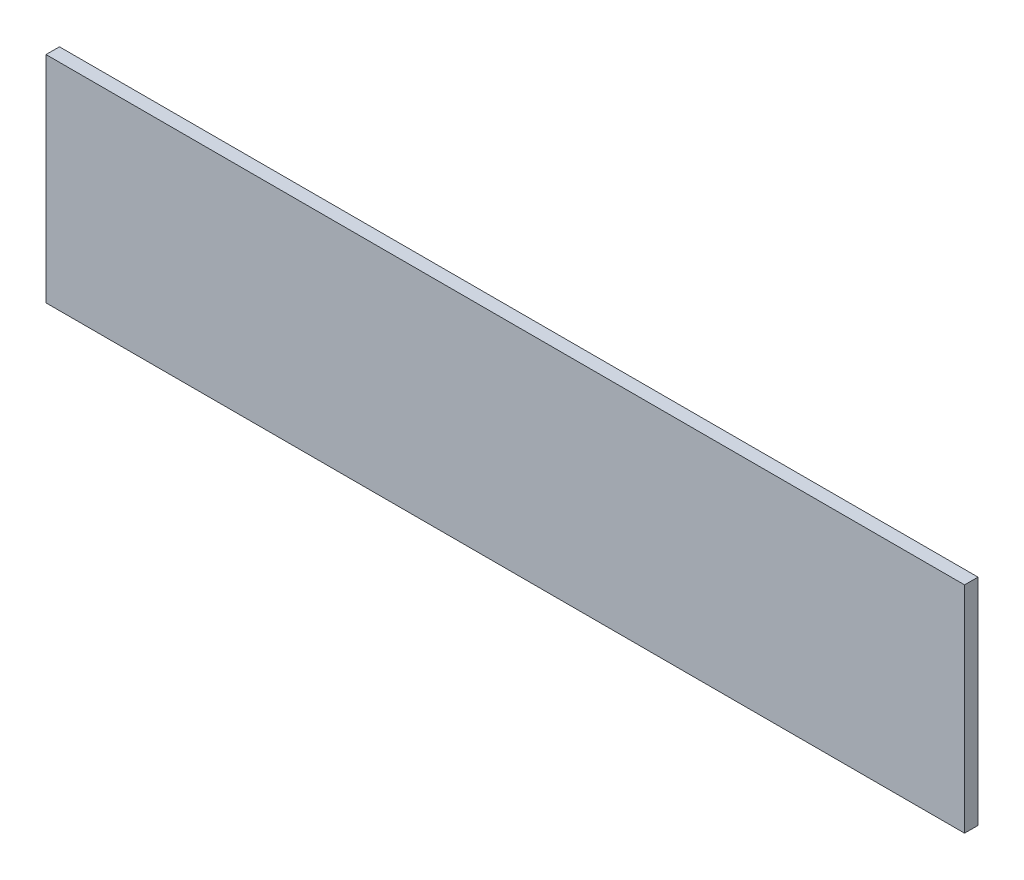
ISO-10303-21;
HEADER;
FILE_DESCRIPTION(('STEP AP214'),'2;1');
FILE_NAME('part.step','',(''),(''),'','','');
FILE_SCHEMA(('AUTOMOTIVE_DESIGN { 1 0 10303 214 1 1 1 1 }'));
ENDSEC;
DATA;
#1=APPLICATION_CONTEXT('core data for automotive mechanical design processes');
#2=APPLICATION_PROTOCOL_DEFINITION('international standard','automotive_design',2000,#1);
#3=PRODUCT_CONTEXT('',#1,'mechanical');
#4=PRODUCT('Part','Part','',(#3));
#5=PRODUCT_RELATED_PRODUCT_CATEGORY('part','',(#4));
#6=PRODUCT_DEFINITION_FORMATION('','',#4);
#7=PRODUCT_DEFINITION_CONTEXT('part definition',#1,'design');
#8=PRODUCT_DEFINITION('design','',#6,#7);
#9=PRODUCT_DEFINITION_SHAPE('','',#8);
#10=(LENGTH_UNIT() NAMED_UNIT(*) SI_UNIT(.MILLI.,.METRE.));
#11=(NAMED_UNIT(*) PLANE_ANGLE_UNIT() SI_UNIT($,.RADIAN.));
#12=(NAMED_UNIT(*) SI_UNIT($,.STERADIAN.) SOLID_ANGLE_UNIT());
#13=UNCERTAINTY_MEASURE_WITH_UNIT(LENGTH_MEASURE(1.E-05),#10,'distance_accuracy_value','');
#14=(GEOMETRIC_REPRESENTATION_CONTEXT(3) GLOBAL_UNCERTAINTY_ASSIGNED_CONTEXT((#13)) GLOBAL_UNIT_ASSIGNED_CONTEXT((#10,
#11,#12)) REPRESENTATION_CONTEXT('',''));
#15=CARTESIAN_POINT('',(0.,0.,0.));
#16=DIRECTION('',(0.,0.,1.));
#17=DIRECTION('',(1.,0.,0.));
#18=AXIS2_PLACEMENT_3D('',#15,#16,#17);
#19=CARTESIAN_POINT('',(102.5,24.,3.));
#20=DIRECTION('',(-1.,0.,0.));
#21=DIRECTION('',(0.,0.,1.));
#22=AXIS2_PLACEMENT_3D('',#19,#20,#21);
#23=PLANE('',#22);
#24=DIRECTION('',(0.,1.,0.));
#25=VECTOR('',#24,1.);
#26=CARTESIAN_POINT('',(102.5,24.,0.));
#27=LINE('',#26,#25);
#28=CARTESIAN_POINT('',(102.5,-24.,0.));
#29=VERTEX_POINT('',#28);
#30=CARTESIAN_POINT('',(102.5,24.,0.));
#31=VERTEX_POINT('',#30);
#32=EDGE_CURVE('E96',#29,#31,#27,.T.);
#33=ORIENTED_EDGE('',*,*,#32,.T.);
#34=DIRECTION('',(0.,0.,-1.));
#35=VECTOR('',#34,1.);
#36=CARTESIAN_POINT('',(102.5,24.,3.));
#37=LINE('',#36,#35);
#38=CARTESIAN_POINT('',(102.5,24.,3.));
#39=VERTEX_POINT('',#38);
#40=EDGE_CURVE('E11',#39,#31,#37,.T.);
#41=ORIENTED_EDGE('',*,*,#40,.F.);
#42=DIRECTION('',(0.,1.,0.));
#43=VECTOR('',#42,1.);
#44=CARTESIAN_POINT('',(102.5,24.,3.));
#45=LINE('',#44,#43);
#46=CARTESIAN_POINT('',(102.5,-24.,3.));
#47=VERTEX_POINT('',#46);
#48=EDGE_CURVE('E84',#47,#39,#45,.T.);
#49=ORIENTED_EDGE('',*,*,#48,.F.);
#50=DIRECTION('',(0.,0.,-1.));
#51=VECTOR('',#50,1.);
#52=CARTESIAN_POINT('',(102.5,-24.,3.));
#53=LINE('',#52,#51);
#54=EDGE_CURVE('E92',#47,#29,#53,.T.);
#55=ORIENTED_EDGE('',*,*,#54,.T.);
#56=EDGE_LOOP('',(#33,#41,#49,#55));
#57=FACE_BOUND('',#56,.T.);
#58=ADVANCED_FACE('F33',(#57),#23,.F.);
#59=CARTESIAN_POINT('',(-102.5,24.,3.));
#60=DIRECTION('',(0.,-1.,0.));
#61=DIRECTION('',(0.,0.,-1.));
#62=AXIS2_PLACEMENT_3D('',#59,#60,#61);
#63=PLANE('',#62);
#64=DIRECTION('',(-1.,0.,0.));
#65=VECTOR('',#64,1.);
#66=CARTESIAN_POINT('',(-102.5,24.,0.));
#67=LINE('',#66,#65);
#68=CARTESIAN_POINT('',(-102.5,24.,0.));
#69=VERTEX_POINT('',#68);
#70=EDGE_CURVE('E88',#31,#69,#67,.T.);
#71=ORIENTED_EDGE('',*,*,#70,.T.);
#72=DIRECTION('',(0.,0.,-1.));
#73=VECTOR('',#72,1.);
#74=CARTESIAN_POINT('',(-102.5,24.,3.));
#75=LINE('',#74,#73);
#76=CARTESIAN_POINT('',(-102.5,24.,3.));
#77=VERTEX_POINT('',#76);
#78=EDGE_CURVE('E41',#77,#69,#75,.T.);
#79=ORIENTED_EDGE('',*,*,#78,.F.);
#80=DIRECTION('',(-1.,0.,0.));
#81=VECTOR('',#80,1.);
#82=CARTESIAN_POINT('',(-102.5,24.,3.));
#83=LINE('',#82,#81);
#84=EDGE_CURVE('E79',#39,#77,#83,.T.);
#85=ORIENTED_EDGE('',*,*,#84,.F.);
#86=ORIENTED_EDGE('',*,*,#40,.T.);
#87=EDGE_LOOP('',(#71,#79,#85,#86));
#88=FACE_BOUND('',#87,.T.);
#89=ADVANCED_FACE('F87',(#88),#63,.F.);
#90=CARTESIAN_POINT('',(-102.5,24.,3.));
#91=DIRECTION('',(1.,0.,0.));
#92=DIRECTION('',(0.,0.,-1.));
#93=AXIS2_PLACEMENT_3D('',#90,#91,#92);
#94=PLANE('',#93);
#95=DIRECTION('',(0.,-1.,0.));
#96=VECTOR('',#95,1.);
#97=CARTESIAN_POINT('',(-102.5,24.,0.));
#98=LINE('',#97,#96);
#99=CARTESIAN_POINT('',(-102.5,-24.,0.));
#100=VERTEX_POINT('',#99);
#101=EDGE_CURVE('E66',#69,#100,#98,.T.);
#102=ORIENTED_EDGE('',*,*,#101,.T.);
#103=DIRECTION('',(0.,0.,-1.));
#104=VECTOR('',#103,1.);
#105=CARTESIAN_POINT('',(-102.5,-24.,3.));
#106=LINE('',#105,#104);
#107=CARTESIAN_POINT('',(-102.5,-24.,3.));
#108=VERTEX_POINT('',#107);
#109=EDGE_CURVE('E89',#108,#100,#106,.T.);
#110=ORIENTED_EDGE('',*,*,#109,.F.);
#111=DIRECTION('',(0.,-1.,0.));
#112=VECTOR('',#111,1.);
#113=CARTESIAN_POINT('',(-102.5,24.,3.));
#114=LINE('',#113,#112);
#115=EDGE_CURVE('E82',#77,#108,#114,.T.);
#116=ORIENTED_EDGE('',*,*,#115,.F.);
#117=ORIENTED_EDGE('',*,*,#78,.T.);
#118=EDGE_LOOP('',(#102,#110,#116,#117));
#119=FACE_BOUND('',#118,.T.);
#120=ADVANCED_FACE('F90',(#119),#94,.F.);
#121=CARTESIAN_POINT('',(-102.5,-24.,3.));
#122=DIRECTION('',(0.,1.,0.));
#123=DIRECTION('',(0.,0.,1.));
#124=AXIS2_PLACEMENT_3D('',#121,#122,#123);
#125=PLANE('',#124);
#126=DIRECTION('',(1.,0.,0.));
#127=VECTOR('',#126,1.);
#128=CARTESIAN_POINT('',(-102.5,-24.,0.));
#129=LINE('',#128,#127);
#130=EDGE_CURVE('E72',#100,#29,#129,.T.);
#131=ORIENTED_EDGE('',*,*,#130,.T.);
#132=ORIENTED_EDGE('',*,*,#54,.F.);
#133=DIRECTION('',(1.,0.,0.));
#134=VECTOR('',#133,1.);
#135=CARTESIAN_POINT('',(-102.5,-24.,3.));
#136=LINE('',#135,#134);
#137=EDGE_CURVE('E49',#108,#47,#136,.T.);
#138=ORIENTED_EDGE('',*,*,#137,.F.);
#139=ORIENTED_EDGE('',*,*,#109,.T.);
#140=EDGE_LOOP('',(#131,#132,#138,#139));
#141=FACE_BOUND('',#140,.T.);
#142=ADVANCED_FACE('F103',(#141),#125,.F.);
#143=CARTESIAN_POINT('',(0.,0.,3.));
#144=DIRECTION('',(0.,0.,1.));
#145=DIRECTION('',(1.,0.,0.));
#146=AXIS2_PLACEMENT_3D('',#143,#144,#145);
#147=PLANE('',#146);
#148=ORIENTED_EDGE('',*,*,#48,.T.);
#149=ORIENTED_EDGE('',*,*,#84,.T.);
#150=ORIENTED_EDGE('',*,*,#115,.T.);
#151=ORIENTED_EDGE('',*,*,#137,.T.);
#152=EDGE_LOOP('',(#148,#149,#150,#151));
#153=FACE_BOUND('',#152,.T.);
#154=ADVANCED_FACE('F80',(#153),#147,.T.);
#155=CARTESIAN_POINT('',(0.,0.,0.));
#156=DIRECTION('',(0.,0.,1.));
#157=DIRECTION('',(1.,0.,0.));
#158=AXIS2_PLACEMENT_3D('',#155,#156,#157);
#159=PLANE('',#158);
#160=ORIENTED_EDGE('',*,*,#32,.F.);
#161=ORIENTED_EDGE('',*,*,#130,.F.);
#162=ORIENTED_EDGE('',*,*,#101,.F.);
#163=ORIENTED_EDGE('',*,*,#70,.F.);
#164=EDGE_LOOP('',(#160,#161,#162,#163));
#165=FACE_BOUND('',#164,.T.);
#166=ADVANCED_FACE('F106',(#165),#159,.F.);
#167=CLOSED_SHELL('',(#58,#89,#120,#142,#154,#166));
#168=MANIFOLD_SOLID_BREP('B2',#167);
#169=ADVANCED_BREP_SHAPE_REPRESENTATION('',(#18,#168),#14);
#170=SHAPE_DEFINITION_REPRESENTATION(#9,#169);
ENDSEC;
END-ISO-10303-21;
